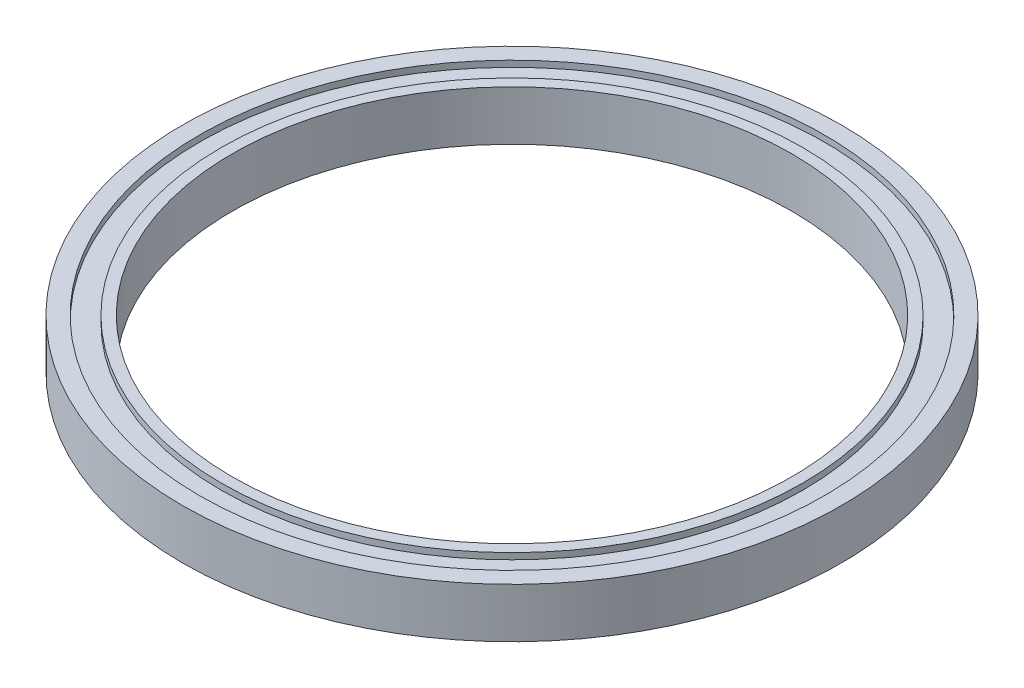
ISO-10303-21;
HEADER;
FILE_DESCRIPTION(('STEP AP214'),'2;1');
FILE_NAME('part.step','',(''),(''),'','','');
FILE_SCHEMA(('AUTOMOTIVE_DESIGN { 1 0 10303 214 1 1 1 1 }'));
ENDSEC;
DATA;
#1=APPLICATION_CONTEXT('core data for automotive mechanical design processes');
#2=APPLICATION_PROTOCOL_DEFINITION('international standard','automotive_design',2000,#1);
#3=PRODUCT_CONTEXT('',#1,'mechanical');
#4=PRODUCT('Part','Part','',(#3));
#5=PRODUCT_RELATED_PRODUCT_CATEGORY('part','',(#4));
#6=PRODUCT_DEFINITION_FORMATION('','',#4);
#7=PRODUCT_DEFINITION_CONTEXT('part definition',#1,'design');
#8=PRODUCT_DEFINITION('design','',#6,#7);
#9=PRODUCT_DEFINITION_SHAPE('','',#8);
#10=(LENGTH_UNIT() NAMED_UNIT(*) SI_UNIT(.MILLI.,.METRE.));
#11=(NAMED_UNIT(*) PLANE_ANGLE_UNIT() SI_UNIT($,.RADIAN.));
#12=(NAMED_UNIT(*) SI_UNIT($,.STERADIAN.) SOLID_ANGLE_UNIT());
#13=UNCERTAINTY_MEASURE_WITH_UNIT(LENGTH_MEASURE(1.E-05),#10,'distance_accuracy_value','');
#14=(GEOMETRIC_REPRESENTATION_CONTEXT(3) GLOBAL_UNCERTAINTY_ASSIGNED_CONTEXT((#13)) GLOBAL_UNIT_ASSIGNED_CONTEXT((#10,
#11,#12)) REPRESENTATION_CONTEXT('',''));
#15=CARTESIAN_POINT('',(0.,0.,0.));
#16=DIRECTION('',(0.,0.,1.));
#17=DIRECTION('',(1.,0.,0.));
#18=AXIS2_PLACEMENT_3D('',#15,#16,#17);
#19=CARTESIAN_POINT('',(0.,0.,0.));
#20=DIRECTION('',(0.,1.,0.));
#21=DIRECTION('',(0.,0.,1.));
#22=AXIS2_PLACEMENT_3D('',#19,#20,#21);
#23=PLANE('',#22);
#24=CARTESIAN_POINT('',(0.,0.,0.));
#25=DIRECTION('',(0.,1.,0.));
#26=DIRECTION('',(0.,0.,1.));
#27=AXIS2_PLACEMENT_3D('',#24,#25,#26);
#28=CIRCLE('',#27,45.);
#29=CARTESIAN_POINT('',(0.,0.,45.));
#30=VERTEX_POINT('',#29);
#31=EDGE_CURVE('E47',#30,#30,#28,.T.);
#32=ORIENTED_EDGE('',*,*,#31,.T.);
#33=EDGE_LOOP('',(#32));
#34=FACE_BOUND('',#33,.T.);
#35=CARTESIAN_POINT('',(0.,0.,0.));
#36=DIRECTION('',(0.,1.,0.));
#37=DIRECTION('',(0.,0.,1.));
#38=AXIS2_PLACEMENT_3D('',#35,#36,#37);
#39=CIRCLE('',#38,46.75);
#40=CARTESIAN_POINT('',(0.,0.,46.75));
#41=VERTEX_POINT('',#40);
#42=EDGE_CURVE('E71',#41,#41,#39,.T.);
#43=ORIENTED_EDGE('',*,*,#42,.F.);
#44=EDGE_LOOP('',(#43));
#45=FACE_BOUND('',#44,.T.);
#46=ADVANCED_FACE('F34',(#34,#45),#23,.F.);
#47=CARTESIAN_POINT('',(0.,8.,0.));
#48=DIRECTION('',(0.,1.,0.));
#49=DIRECTION('',(0.,0.,1.));
#50=AXIS2_PLACEMENT_3D('',#47,#48,#49);
#51=PLANE('',#50);
#52=CARTESIAN_POINT('',(0.,8.,0.));
#53=DIRECTION('',(0.,1.,0.));
#54=DIRECTION('',(0.,0.,1.));
#55=AXIS2_PLACEMENT_3D('',#52,#53,#54);
#56=CIRCLE('',#55,45.);
#57=CARTESIAN_POINT('',(0.,8.,45.));
#58=VERTEX_POINT('',#57);
#59=EDGE_CURVE('E45',#58,#58,#56,.T.);
#60=ORIENTED_EDGE('',*,*,#59,.F.);
#61=EDGE_LOOP('',(#60));
#62=FACE_BOUND('',#61,.T.);
#63=CARTESIAN_POINT('',(0.,8.,0.));
#64=DIRECTION('',(0.,1.,0.));
#65=DIRECTION('',(0.,0.,1.));
#66=AXIS2_PLACEMENT_3D('',#63,#64,#65);
#67=CIRCLE('',#66,46.75);
#68=CARTESIAN_POINT('',(0.,8.,46.75));
#69=VERTEX_POINT('',#68);
#70=EDGE_CURVE('E59',#69,#69,#67,.T.);
#71=ORIENTED_EDGE('',*,*,#70,.T.);
#72=EDGE_LOOP('',(#71));
#73=FACE_BOUND('',#72,.T.);
#74=ADVANCED_FACE('F87',(#62,#73),#51,.T.);
#75=CARTESIAN_POINT('',(0.,8.,0.));
#76=DIRECTION('',(0.,1.,0.));
#77=DIRECTION('',(0.,0.,1.));
#78=AXIS2_PLACEMENT_3D('',#75,#76,#77);
#79=CIRCLE('',#78,50.25);
#80=CARTESIAN_POINT('',(0.,8.,50.25));
#81=VERTEX_POINT('',#80);
#82=EDGE_CURVE('E53',#81,#81,#79,.T.);
#83=ORIENTED_EDGE('',*,*,#82,.F.);
#84=EDGE_LOOP('',(#83));
#85=FACE_BOUND('',#84,.T.);
#86=CARTESIAN_POINT('',(0.,8.,0.));
#87=DIRECTION('',(0.,1.,0.));
#88=DIRECTION('',(0.,0.,1.));
#89=AXIS2_PLACEMENT_3D('',#86,#87,#88);
#90=CIRCLE('',#89,53.);
#91=CARTESIAN_POINT('',(0.,8.,53.));
#92=VERTEX_POINT('',#91);
#93=EDGE_CURVE('E10',#92,#92,#90,.T.);
#94=ORIENTED_EDGE('',*,*,#93,.T.);
#95=EDGE_LOOP('',(#94));
#96=FACE_BOUND('',#95,.T.);
#97=ADVANCED_FACE('F93',(#85,#96),#51,.T.);
#98=CARTESIAN_POINT('',(0.,0.,0.));
#99=DIRECTION('',(0.,1.,0.));
#100=DIRECTION('',(0.,0.,1.));
#101=AXIS2_PLACEMENT_3D('',#98,#99,#100);
#102=CIRCLE('',#101,50.25);
#103=CARTESIAN_POINT('',(0.,0.,50.25));
#104=VERTEX_POINT('',#103);
#105=EDGE_CURVE('E65',#104,#104,#102,.T.);
#106=ORIENTED_EDGE('',*,*,#105,.T.);
#107=EDGE_LOOP('',(#106));
#108=FACE_BOUND('',#107,.T.);
#109=CARTESIAN_POINT('',(0.,0.,0.));
#110=DIRECTION('',(0.,1.,0.));
#111=DIRECTION('',(0.,0.,1.));
#112=AXIS2_PLACEMENT_3D('',#109,#110,#111);
#113=CIRCLE('',#112,53.);
#114=CARTESIAN_POINT('',(0.,0.,53.));
#115=VERTEX_POINT('',#114);
#116=EDGE_CURVE('E38',#115,#115,#113,.T.);
#117=ORIENTED_EDGE('',*,*,#116,.F.);
#118=EDGE_LOOP('',(#117));
#119=FACE_BOUND('',#118,.T.);
#120=ADVANCED_FACE('F89',(#108,#119),#23,.F.);
#121=CARTESIAN_POINT('',(0.,8.,0.));
#122=DIRECTION('',(0.,-1.,0.));
#123=DIRECTION('',(0.,0.,-1.));
#124=AXIS2_PLACEMENT_3D('',#121,#122,#123);
#125=CYLINDRICAL_SURFACE('',#124,53.);
#126=ORIENTED_EDGE('',*,*,#93,.F.);
#127=EDGE_LOOP('',(#126));
#128=FACE_BOUND('',#127,.T.);
#129=ORIENTED_EDGE('',*,*,#116,.T.);
#130=EDGE_LOOP('',(#129));
#131=FACE_BOUND('',#130,.T.);
#132=ADVANCED_FACE('F36',(#128,#131),#125,.T.);
#133=CARTESIAN_POINT('',(0.,8.,0.));
#134=DIRECTION('',(0.,-1.,0.));
#135=DIRECTION('',(0.,0.,-1.));
#136=AXIS2_PLACEMENT_3D('',#133,#134,#135);
#137=CYLINDRICAL_SURFACE('',#136,45.);
#138=ORIENTED_EDGE('',*,*,#59,.T.);
#139=EDGE_LOOP('',(#138));
#140=FACE_BOUND('',#139,.T.);
#141=ORIENTED_EDGE('',*,*,#31,.F.);
#142=EDGE_LOOP('',(#141));
#143=FACE_BOUND('',#142,.T.);
#144=ADVANCED_FACE('F102',(#140,#143),#137,.F.);
#145=CARTESIAN_POINT('',(0.,7.,0.));
#146=DIRECTION('',(0.,1.,0.));
#147=DIRECTION('',(0.,0.,1.));
#148=AXIS2_PLACEMENT_3D('',#145,#146,#147);
#149=CYLINDRICAL_SURFACE('',#148,50.25);
#150=CARTESIAN_POINT('',(0.,7.,0.));
#151=DIRECTION('',(0.,1.,0.));
#152=DIRECTION('',(0.,0.,1.));
#153=AXIS2_PLACEMENT_3D('',#150,#151,#152);
#154=CIRCLE('',#153,50.25);
#155=CARTESIAN_POINT('',(0.,7.,50.25));
#156=VERTEX_POINT('',#155);
#157=EDGE_CURVE('E50',#156,#156,#154,.T.);
#158=ORIENTED_EDGE('',*,*,#157,.F.);
#159=EDGE_LOOP('',(#158));
#160=FACE_BOUND('',#159,.T.);
#161=ORIENTED_EDGE('',*,*,#82,.T.);
#162=EDGE_LOOP('',(#161));
#163=FACE_BOUND('',#162,.T.);
#164=ADVANCED_FACE('F126',(#160,#163),#149,.F.);
#165=CARTESIAN_POINT('',(0.,7.,0.));
#166=DIRECTION('',(0.,1.,0.));
#167=DIRECTION('',(0.,0.,1.));
#168=AXIS2_PLACEMENT_3D('',#165,#166,#167);
#169=PLANE('',#168);
#170=CARTESIAN_POINT('',(0.,7.,0.));
#171=DIRECTION('',(0.,1.,0.));
#172=DIRECTION('',(0.,0.,1.));
#173=AXIS2_PLACEMENT_3D('',#170,#171,#172);
#174=CIRCLE('',#173,46.75);
#175=CARTESIAN_POINT('',(0.,7.,46.75));
#176=VERTEX_POINT('',#175);
#177=EDGE_CURVE('E56',#176,#176,#174,.T.);
#178=ORIENTED_EDGE('',*,*,#177,.F.);
#179=EDGE_LOOP('',(#178));
#180=FACE_BOUND('',#179,.T.);
#181=ORIENTED_EDGE('',*,*,#157,.T.);
#182=EDGE_LOOP('',(#181));
#183=FACE_BOUND('',#182,.T.);
#184=ADVANCED_FACE('F122',(#180,#183),#169,.T.);
#185=CARTESIAN_POINT('',(0.,7.,0.));
#186=DIRECTION('',(0.,1.,0.));
#187=DIRECTION('',(0.,0.,1.));
#188=AXIS2_PLACEMENT_3D('',#185,#186,#187);
#189=CYLINDRICAL_SURFACE('',#188,46.75);
#190=ORIENTED_EDGE('',*,*,#177,.T.);
#191=EDGE_LOOP('',(#190));
#192=FACE_BOUND('',#191,.T.);
#193=ORIENTED_EDGE('',*,*,#70,.F.);
#194=EDGE_LOOP('',(#193));
#195=FACE_BOUND('',#194,.T.);
#196=ADVANCED_FACE('F116',(#192,#195),#189,.T.);
#197=CARTESIAN_POINT('',(0.,1.,0.));
#198=DIRECTION('',(0.,1.,0.));
#199=DIRECTION('',(0.,0.,1.));
#200=AXIS2_PLACEMENT_3D('',#197,#198,#199);
#201=PLANE('',#200);
#202=CARTESIAN_POINT('',(0.,1.,0.));
#203=DIRECTION('',(0.,1.,0.));
#204=DIRECTION('',(0.,0.,1.));
#205=AXIS2_PLACEMENT_3D('',#202,#203,#204);
#206=CIRCLE('',#205,50.25);
#207=CARTESIAN_POINT('',(0.,1.,50.25));
#208=VERTEX_POINT('',#207);
#209=EDGE_CURVE('E62',#208,#208,#206,.T.);
#210=ORIENTED_EDGE('',*,*,#209,.F.);
#211=EDGE_LOOP('',(#210));
#212=FACE_BOUND('',#211,.T.);
#213=CARTESIAN_POINT('',(0.,1.,0.));
#214=DIRECTION('',(0.,1.,0.));
#215=DIRECTION('',(0.,0.,1.));
#216=AXIS2_PLACEMENT_3D('',#213,#214,#215);
#217=CIRCLE('',#216,46.75);
#218=CARTESIAN_POINT('',(0.,1.,46.75));
#219=VERTEX_POINT('',#218);
#220=EDGE_CURVE('E68',#219,#219,#217,.T.);
#221=ORIENTED_EDGE('',*,*,#220,.T.);
#222=EDGE_LOOP('',(#221));
#223=FACE_BOUND('',#222,.T.);
#224=ADVANCED_FACE('F77',(#212,#223),#201,.F.);
#225=CARTESIAN_POINT('',(0.,1.,0.));
#226=DIRECTION('',(0.,-1.,0.));
#227=DIRECTION('',(0.,0.,-1.));
#228=AXIS2_PLACEMENT_3D('',#225,#226,#227);
#229=CYLINDRICAL_SURFACE('',#228,50.25);
#230=ORIENTED_EDGE('',*,*,#209,.T.);
#231=EDGE_LOOP('',(#230));
#232=FACE_BOUND('',#231,.T.);
#233=ORIENTED_EDGE('',*,*,#105,.F.);
#234=EDGE_LOOP('',(#233));
#235=FACE_BOUND('',#234,.T.);
#236=ADVANCED_FACE('F82',(#232,#235),#229,.F.);
#237=CARTESIAN_POINT('',(0.,1.,0.));
#238=DIRECTION('',(0.,-1.,0.));
#239=DIRECTION('',(0.,0.,-1.));
#240=AXIS2_PLACEMENT_3D('',#237,#238,#239);
#241=CYLINDRICAL_SURFACE('',#240,46.75);
#242=ORIENTED_EDGE('',*,*,#220,.F.);
#243=EDGE_LOOP('',(#242));
#244=FACE_BOUND('',#243,.T.);
#245=ORIENTED_EDGE('',*,*,#42,.T.);
#246=EDGE_LOOP('',(#245));
#247=FACE_BOUND('',#246,.T.);
#248=ADVANCED_FACE('F79',(#244,#247),#241,.T.);
#249=CLOSED_SHELL('',(#46,#74,#97,#120,#132,#144,#164,#184,#196,#224,#236,#248));
#250=MANIFOLD_SOLID_BREP('B2',#249);
#251=ADVANCED_BREP_SHAPE_REPRESENTATION('',(#18,#250),#14);
#252=SHAPE_DEFINITION_REPRESENTATION(#9,#251);
ENDSEC;
END-ISO-10303-21;
